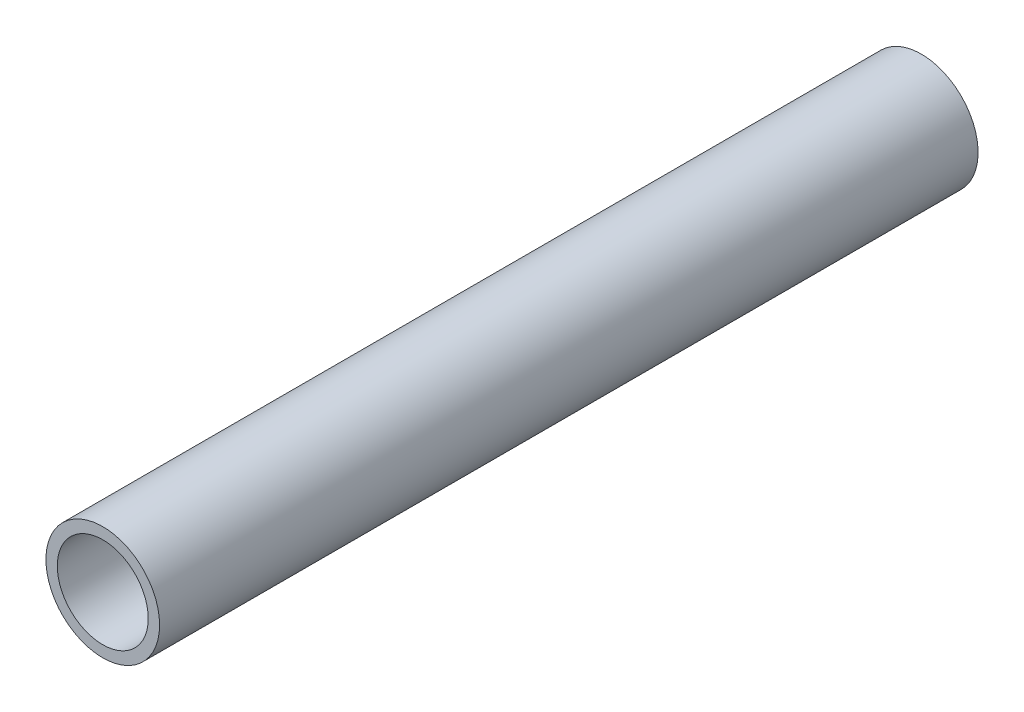
ISO-10303-21;
HEADER;
FILE_DESCRIPTION(('STEP AP214'),'2;1');
FILE_NAME('part.step','',(''),(''),'','','');
FILE_SCHEMA(('AUTOMOTIVE_DESIGN { 1 0 10303 214 1 1 1 1 }'));
ENDSEC;
DATA;
#1=APPLICATION_CONTEXT('core data for automotive mechanical design processes');
#2=APPLICATION_PROTOCOL_DEFINITION('international standard','automotive_design',2000,#1);
#3=PRODUCT_CONTEXT('',#1,'mechanical');
#4=PRODUCT('Part','Part','',(#3));
#5=PRODUCT_RELATED_PRODUCT_CATEGORY('part','',(#4));
#6=PRODUCT_DEFINITION_FORMATION('','',#4);
#7=PRODUCT_DEFINITION_CONTEXT('part definition',#1,'design');
#8=PRODUCT_DEFINITION('design','',#6,#7);
#9=PRODUCT_DEFINITION_SHAPE('','',#8);
#10=(LENGTH_UNIT() NAMED_UNIT(*) SI_UNIT(.MILLI.,.METRE.));
#11=(NAMED_UNIT(*) PLANE_ANGLE_UNIT() SI_UNIT($,.RADIAN.));
#12=(NAMED_UNIT(*) SI_UNIT($,.STERADIAN.) SOLID_ANGLE_UNIT());
#13=UNCERTAINTY_MEASURE_WITH_UNIT(LENGTH_MEASURE(1.E-05),#10,'distance_accuracy_value','');
#14=(GEOMETRIC_REPRESENTATION_CONTEXT(3) GLOBAL_UNCERTAINTY_ASSIGNED_CONTEXT((#13)) GLOBAL_UNIT_ASSIGNED_CONTEXT((#10,
#11,#12)) REPRESENTATION_CONTEXT('',''));
#15=CARTESIAN_POINT('',(0.,0.,0.));
#16=DIRECTION('',(0.,0.,1.));
#17=DIRECTION('',(1.,0.,0.));
#18=AXIS2_PLACEMENT_3D('',#15,#16,#17);
#19=CARTESIAN_POINT('',(0.,0.,0.));
#20=DIRECTION('',(0.,0.,1.));
#21=DIRECTION('',(1.,0.,0.));
#22=AXIS2_PLACEMENT_3D('',#19,#20,#21);
#23=PLANE('',#22);
#24=DIRECTION('',(-1.,0.,0.));
#25=VECTOR('',#24,1.);
#26=CARTESIAN_POINT('',(5.,-11.4564392373896,0.));
#27=LINE('',#26,#25);
#28=CARTESIAN_POINT('',(5.,-11.4564392373896,0.));
#29=VERTEX_POINT('',#28);
#30=CARTESIAN_POINT('',(-5.,-11.4564392373896,0.));
#31=VERTEX_POINT('',#30);
#32=EDGE_CURVE('E242',#29,#31,#27,.T.);
#33=ORIENTED_EDGE('',*,*,#32,.F.);
#34=CARTESIAN_POINT('',(0.,0.,0.));
#35=DIRECTION('',(0.,0.,1.));
#36=DIRECTION('',(1.,0.,0.));
#37=AXIS2_PLACEMENT_3D('',#34,#35,#36);
#38=CIRCLE('',#37,12.5);
#39=EDGE_CURVE('E237',#31,#29,#38,.T.);
#40=ORIENTED_EDGE('',*,*,#39,.F.);
#41=EDGE_LOOP('',(#33,#40));
#42=FACE_BOUND('',#41,.T.);
#43=ADVANCED_FACE('F40',(#42),#23,.F.);
#44=DIRECTION('',(-1.,0.,0.));
#45=VECTOR('',#44,1.);
#46=CARTESIAN_POINT('',(5.,11.4564392373896,0.));
#47=LINE('',#46,#45);
#48=CARTESIAN_POINT('',(-5.,11.4564392373896,0.));
#49=VERTEX_POINT('',#48);
#50=CARTESIAN_POINT('',(5.,11.4564392373896,0.));
#51=VERTEX_POINT('',#50);
#52=EDGE_CURVE('E246',#49,#51,#47,.F.);
#53=ORIENTED_EDGE('',*,*,#52,.F.);
#54=EDGE_CURVE('E229',#51,#49,#38,.T.);
#55=ORIENTED_EDGE('',*,*,#54,.F.);
#56=EDGE_LOOP('',(#53,#55));
#57=FACE_BOUND('',#56,.T.);
#58=ADVANCED_FACE('F187',(#57),#23,.F.);
#59=CARTESIAN_POINT('',(0.,0.,180.));
#60=DIRECTION('',(0.,0.,1.));
#61=DIRECTION('',(1.,0.,0.));
#62=AXIS2_PLACEMENT_3D('',#59,#60,#61);
#63=PLANE('',#62);
#64=CARTESIAN_POINT('',(0.,0.,180.));
#65=DIRECTION('',(0.,0.,1.));
#66=DIRECTION('',(1.,0.,0.));
#67=AXIS2_PLACEMENT_3D('',#64,#65,#66);
#68=CIRCLE('',#67,12.5);
#69=CARTESIAN_POINT('',(12.5,0.,180.));
#70=VERTEX_POINT('',#69);
#71=EDGE_CURVE('E113',#70,#70,#68,.T.);
#72=ORIENTED_EDGE('',*,*,#71,.T.);
#73=EDGE_LOOP('',(#72));
#74=FACE_BOUND('',#73,.T.);
#75=CARTESIAN_POINT('',(0.,0.,180.));
#76=DIRECTION('',(0.,0.,1.));
#77=DIRECTION('',(1.,0.,0.));
#78=AXIS2_PLACEMENT_3D('',#75,#76,#77);
#79=CIRCLE('',#78,10.);
#80=CARTESIAN_POINT('',(10.,0.,180.));
#81=VERTEX_POINT('',#80);
#82=EDGE_CURVE('E217',#81,#81,#79,.T.);
#83=ORIENTED_EDGE('',*,*,#82,.F.);
#84=EDGE_LOOP('',(#83));
#85=FACE_BOUND('',#84,.T.);
#86=ADVANCED_FACE('F194',(#74,#85),#63,.T.);
#87=EDGE_CURVE('E210',#29,#51,#38,.T.);
#88=ORIENTED_EDGE('',*,*,#87,.F.);
#89=DIRECTION('',(0.,1.,0.));
#90=VECTOR('',#89,1.);
#91=CARTESIAN_POINT('',(5.,0.,0.));
#92=LINE('',#91,#90);
#93=CARTESIAN_POINT('',(5.,-10.9087121146357,0.));
#94=VERTEX_POINT('',#93);
#95=EDGE_CURVE('E218',#29,#94,#92,.T.);
#96=ORIENTED_EDGE('',*,*,#95,.T.);
#97=DIRECTION('',(-1.,0.,0.));
#98=VECTOR('',#97,1.);
#99=CARTESIAN_POINT('',(5.,-10.9087121146357,0.));
#100=LINE('',#99,#98);
#101=CARTESIAN_POINT('',(-5.,-10.9087121146357,0.));
#102=VERTEX_POINT('',#101);
#103=EDGE_CURVE('E251',#94,#102,#100,.T.);
#104=ORIENTED_EDGE('',*,*,#103,.T.);
#105=DIRECTION('',(0.,1.,0.));
#106=VECTOR('',#105,1.);
#107=CARTESIAN_POINT('',(-5.,0.,0.));
#108=LINE('',#107,#106);
#109=EDGE_CURVE('E272',#31,#102,#108,.T.);
#110=ORIENTED_EDGE('',*,*,#109,.F.);
#111=EDGE_CURVE('E232',#49,#31,#38,.T.);
#112=ORIENTED_EDGE('',*,*,#111,.F.);
#113=CARTESIAN_POINT('',(-5.,10.9087121146357,0.));
#114=VERTEX_POINT('',#113);
#115=EDGE_CURVE('E270',#114,#49,#108,.T.);
#116=ORIENTED_EDGE('',*,*,#115,.F.);
#117=DIRECTION('',(-1.,0.,0.));
#118=VECTOR('',#117,1.);
#119=CARTESIAN_POINT('',(5.,10.9087121146357,0.));
#120=LINE('',#119,#118);
#121=CARTESIAN_POINT('',(5.,10.9087121146357,0.));
#122=VERTEX_POINT('',#121);
#123=EDGE_CURVE('E120',#114,#122,#120,.F.);
#124=ORIENTED_EDGE('',*,*,#123,.T.);
#125=EDGE_CURVE('E224',#122,#51,#92,.T.);
#126=ORIENTED_EDGE('',*,*,#125,.T.);
#127=EDGE_LOOP('',(#88,#96,#104,#110,#112,#116,#124,#126));
#128=FACE_BOUND('',#127,.T.);
#129=CARTESIAN_POINT('',(0.,0.,0.));
#130=DIRECTION('',(0.,0.,1.));
#131=DIRECTION('',(1.,0.,0.));
#132=AXIS2_PLACEMENT_3D('',#129,#130,#131);
#133=CIRCLE('',#132,10.);
#134=CARTESIAN_POINT('',(10.,0.,0.));
#135=VERTEX_POINT('',#134);
#136=EDGE_CURVE('E214',#135,#135,#133,.T.);
#137=ORIENTED_EDGE('',*,*,#136,.T.);
#138=EDGE_LOOP('',(#137));
#139=FACE_BOUND('',#138,.T.);
#140=ADVANCED_FACE('F189',(#128,#139),#23,.F.);
#141=CARTESIAN_POINT('',(0.,0.,180.));
#142=DIRECTION('',(0.,0.,-1.));
#143=DIRECTION('',(-1.,0.,0.));
#144=AXIS2_PLACEMENT_3D('',#141,#142,#143);
#145=CYLINDRICAL_SURFACE('',#144,12.5);
#146=ORIENTED_EDGE('',*,*,#71,.F.);
#147=EDGE_LOOP('',(#146));
#148=FACE_BOUND('',#147,.T.);
#149=ORIENTED_EDGE('',*,*,#54,.T.);
#150=ORIENTED_EDGE('',*,*,#111,.T.);
#151=ORIENTED_EDGE('',*,*,#39,.T.);
#152=ORIENTED_EDGE('',*,*,#87,.T.);
#153=EDGE_LOOP('',(#149,#150,#151,#152));
#154=FACE_BOUND('',#153,.T.);
#155=ADVANCED_FACE('F42',(#148,#154),#145,.T.);
#156=CARTESIAN_POINT('',(0.,0.,180.));
#157=DIRECTION('',(0.,0.,-1.));
#158=DIRECTION('',(-1.,0.,0.));
#159=AXIS2_PLACEMENT_3D('',#156,#157,#158);
#160=CYLINDRICAL_SURFACE('',#159,10.);
#161=DIRECTION('',(0.,0.,-1.));
#162=VECTOR('',#161,1.);
#163=CARTESIAN_POINT('',(5.,-8.66025403784439,180.));
#164=LINE('',#163,#162);
#165=CARTESIAN_POINT('',(5.,-8.66025403784439,4.01387818865998));
#166=VERTEX_POINT('',#165);
#167=CARTESIAN_POINT('',(5.,-8.66025403784439,3.30662386291808));
#168=VERTEX_POINT('',#167);
#169=EDGE_CURVE('E11',#166,#168,#164,.T.);
#170=ORIENTED_EDGE('',*,*,#169,.F.);
#171=CARTESIAN_POINT('',(5.,-8.66025403784439,4.01387818865998));
#172=CARTESIAN_POINT('',(4.82008154669658,-8.76410176369815,3.91413592086407));
#173=CARTESIAN_POINT('',(4.63627417539551,-8.86277482125367,3.81585166590048));
#174=CARTESIAN_POINT('',(4.26046253513022,-9.04945777136054,3.62410025880277));
#175=CARTESIAN_POINT('',(4.06844552469419,-9.13745021024587,3.53064113108571));
#176=CARTESIAN_POINT('',(3.6735444726537,-9.30330897296587,3.34947749360588));
#177=CARTESIAN_POINT('',(3.47054355256305,-9.38101073590016,3.26187556280599));
#178=CARTESIAN_POINT('',(3.05636570597246,-9.52400065181224,3.09662511759067));
#179=CARTESIAN_POINT('',(2.84519369370648,-9.58929613065176,3.01897073806762));
#180=CARTESIAN_POINT('',(2.4575917232659,-9.69495715150848,2.89070882646822));
#181=CARTESIAN_POINT('',(2.28257576350105,-9.73769870382435,2.83779145738117));
#182=CARTESIAN_POINT('',(1.92789991719414,-9.81407601235486,2.74194234819441));
#183=CARTESIAN_POINT('',(1.74824141347053,-9.84771444652488,2.69900767191055));
#184=CARTESIAN_POINT('',(1.38603690819081,-9.90516637226989,2.62495067166923));
#185=CARTESIAN_POINT('',(1.2035135747387,-9.9290354830804,2.59376156081113));
#186=CARTESIAN_POINT('',(0.835691234393958,-9.96673401065602,2.5442157237096));
#187=CARTESIAN_POINT('',(0.650392381936898,-9.98056398391694,2.52585828617483));
#188=CARTESIAN_POINT('',(0.277023404492982,-9.99792199178797,2.5027843082056));
#189=CARTESIAN_POINT('',(0.0889429239280904,-10.0013703258567,2.49817330267362));
#190=CARTESIAN_POINT('',(-0.286921145275977,-9.99764976573475,2.50313315517893));
#191=CARTESIAN_POINT('',(-0.474704734250775,-9.99048088355496,2.51270399717288));
#192=CARTESIAN_POINT('',(-0.848836131892855,-9.96567705903095,2.54557479353535));
#193=CARTESIAN_POINT('',(-1.03517905304107,-9.94801545212216,2.56890972471664));
#194=CARTESIAN_POINT('',(-1.40458264038539,-9.90261584476655,2.62820964455827));
#195=CARTESIAN_POINT('',(-1.58764287161268,-9.87487651918632,2.66417629416033));
#196=CARTESIAN_POINT('',(-1.99220039244546,-9.80218125114327,2.75702829331244));
#197=CARTESIAN_POINT('',(-2.21257052609303,-9.75470693497974,2.81684746936269));
#198=CARTESIAN_POINT('',(-2.64569626586323,-9.64625293380524,2.95029419175835));
#199=CARTESIAN_POINT('',(-2.85844806127142,-9.58526659670147,3.0239285366944));
#200=CARTESIAN_POINT('',(-3.27602095974106,-9.45070697696876,3.18198736170821));
#201=CARTESIAN_POINT('',(-3.48083355248735,-9.37712062184528,3.26642302488915));
#202=CARTESIAN_POINT('',(-3.88216728590354,-9.21820724995444,3.44326821578856));
#203=CARTESIAN_POINT('',(-4.07869125246982,-9.13288427760634,3.53567499260133));
#204=CARTESIAN_POINT('',(-4.39626872624616,-8.98287114444206,3.69283390198646));
#205=CARTESIAN_POINT('',(-4.51967617717796,-8.92140308246232,3.75595336297528));
#206=CARTESIAN_POINT('',(-4.76259961156357,-8.794108671307,3.88379276030673));
#207=CARTESIAN_POINT('',(-4.88212937403475,-8.7283010532962,3.94850514814532));
#208=CARTESIAN_POINT('',(-5.,-8.66025403784439,4.01387818865998));
#209=B_SPLINE_CURVE_WITH_KNOTS('',3,(#171,#172,#173,#174,#175,#176,#177,#178,#179,#180,#181,
#182,#183,#184,#185,#186,#187,#188,#189,#190,#191,#192,#193,#194,#195,#196,#197,#198,#199,#200,
#201,#202,#203,#204,#205,#206,#207,#208),.UNSPECIFIED.,.F.,.F.,(4,2,2,2,2,2,2,2,2,2,2,2,2,2,2,2,
2,2,4),(0.,0.691341851956641,1.38379866559424,2.08625412807712,2.78829349541358,
3.35112627895848,3.91379330791227,4.47321081224865,5.03259730423154,5.59626743096092,
6.1599369200343,6.72504499459301,7.29022740291808,7.98882324195095,8.68776377342108,
9.38743389753091,10.0868635176568,10.5416445831123,10.9945770557237),.UNSPECIFIED.);
#210=CARTESIAN_POINT('',(-5.,-8.66025403784438,4.01387818865998));
#211=VERTEX_POINT('',#210);
#212=EDGE_CURVE('E49',#166,#211,#209,.T.);
#213=ORIENTED_EDGE('',*,*,#212,.T.);
#214=DIRECTION('',(0.,0.,-1.));
#215=VECTOR('',#214,1.);
#216=CARTESIAN_POINT('',(-5.,-8.66025403784439,180.));
#217=LINE('',#216,#215);
#218=CARTESIAN_POINT('',(-5.,-8.66025403784438,3.30662386291808));
#219=VERTEX_POINT('',#218);
#220=EDGE_CURVE('E167',#211,#219,#217,.T.);
#221=ORIENTED_EDGE('',*,*,#220,.T.);
#222=CARTESIAN_POINT('',(5.,-8.66025403784439,3.30662386291808));
#223=CARTESIAN_POINT('',(4.82516195453835,-8.76116069084542,3.20145819449251));
#224=CARTESIAN_POINT('',(4.64670456953597,-8.85716824931581,3.09749019690897));
#225=CARTESIAN_POINT('',(4.28196806230545,-9.03916673113266,2.89379473618385));
#226=CARTESIAN_POINT('',(4.09567653506667,-9.12514088708735,2.79407454346849));
#227=CARTESIAN_POINT('',(3.71197846270353,-9.2879124620808,2.59941343214977));
#228=CARTESIAN_POINT('',(3.51443553045837,-9.36452577564421,2.50458478071013));
#229=CARTESIAN_POINT('',(3.11122082111521,-9.50610425689326,2.32441795655835));
#230=CARTESIAN_POINT('',(2.90555407478051,-9.57107649959323,2.23907403143837));
#231=CARTESIAN_POINT('',(2.37075207397384,-9.72075056001073,2.03777130738265));
#232=CARTESIAN_POINT('',(2.03558507074426,-9.79682027068555,1.93058217472068));
#233=CARTESIAN_POINT('',(1.52137039526288,-9.88511623587745,1.80346482514438));
#234=CARTESIAN_POINT('',(1.34855608837975,-9.91021214838895,1.76675976869335));
#235=CARTESIAN_POINT('',(0.999704620471346,-9.95145121853615,1.70596558110729));
#236=CARTESIAN_POINT('',(0.823669314534935,-9.96759937164545,1.68186941093524));
#237=CARTESIAN_POINT('',(0.467635326863651,-9.99067050076046,1.64732651345712));
#238=CARTESIAN_POINT('',(0.287614336625637,-9.99748748906368,1.63703662991511));
#239=CARTESIAN_POINT('',(-0.0727722623708487,-10.00135854973,1.63120203279879));
#240=CARTESIAN_POINT('',(-0.25313786225175,-9.99841287029075,1.63565694436544));
#241=CARTESIAN_POINT('',(-0.612874353371986,-9.98282890827138,1.65907798957394));
#242=CARTESIAN_POINT('',(-0.792242295542309,-9.9701699277578,1.67807511079687));
#243=CARTESIAN_POINT('',(-1.14809702262397,-9.93548462910008,1.72956885388206));
#244=CARTESIAN_POINT('',(-1.32458337019917,-9.91345690254543,1.7620675054223));
#245=CARTESIAN_POINT('',(-1.70632159221413,-9.85557726879622,1.84621536728624));
#246=CARTESIAN_POINT('',(-1.91075453125979,-9.81790657135514,1.90031423909942));
#247=CARTESIAN_POINT('',(-2.31295681180811,-9.73101315682729,2.02231975942194));
#248=CARTESIAN_POINT('',(-2.510722654669,-9.68178447922531,2.09023352992985));
#249=CARTESIAN_POINT('',(-2.89963018636721,-9.57251588397588,2.23708015886137));
#250=CARTESIAN_POINT('',(-3.09075277069543,-9.51244744005009,2.31604196542785));
#251=CARTESIAN_POINT('',(-3.46577487631523,-9.3823122890741,2.48220302473786));
#252=CARTESIAN_POINT('',(-3.64967594573692,-9.31224774005098,2.56940049813993));
#253=CARTESIAN_POINT('',(-4.03453037500343,-9.15268290085554,2.76182798685033));
#254=CARTESIAN_POINT('',(-4.23449404591819,-9.06183691476436,2.86791314491051));
#255=CARTESIAN_POINT('',(-4.62429787880894,-8.8691923764082,3.08445929666655));
#256=CARTESIAN_POINT('',(-4.81420314802685,-8.76748182146515,3.19488114407874));
#257=CARTESIAN_POINT('',(-5.,-8.66025403784439,3.30662386291808));
#258=B_SPLINE_CURVE_WITH_KNOTS('',3,(#222,#223,#224,#225,#226,#227,#228,#229,#230,#231,#232,
#233,#234,#235,#236,#237,#238,#239,#240,#241,#242,#243,#244,#245,#246,#247,#248,#249,#250,#251,
#252,#253,#254,#255,#256,#257),.UNSPECIFIED.,.F.,.F.,(4,2,2,2,2,2,2,2,2,2,2,2,2,2,2,2,2,4),(0.,
0.68284922287536,1.36682373036995,2.06260941823754,2.75797078804696,3.83347678621023,
4.36823430697502,4.90269297464557,5.44317325993769,5.98363980462796,6.52526123100377,
7.06696410852384,7.71035015169294,8.35406872429875,8.99950670982006,9.64480556406339,
10.376022596591,11.1017114061016),.UNSPECIFIED.);
#259=EDGE_CURVE('E159',#168,#219,#258,.T.);
#260=ORIENTED_EDGE('',*,*,#259,.F.);
#261=EDGE_LOOP('',(#170,#213,#221,#260));
#262=FACE_BOUND('',#261,.T.);
#263=DIRECTION('',(0.,0.,-1.));
#264=VECTOR('',#263,1.);
#265=CARTESIAN_POINT('',(5.,8.66025403784439,180.));
#266=LINE('',#265,#264);
#267=CARTESIAN_POINT('',(5.,8.66025403784439,3.30662386291808));
#268=VERTEX_POINT('',#267);
#269=CARTESIAN_POINT('',(5.,8.66025403784439,4.01387818865998));
#270=VERTEX_POINT('',#269);
#271=EDGE_CURVE('E128',#268,#270,#266,.F.);
#272=ORIENTED_EDGE('',*,*,#271,.F.);
#273=CARTESIAN_POINT('',(-5.,8.66025403784439,3.30662386291808));
#274=CARTESIAN_POINT('',(-4.82516195453835,8.76116069084542,3.20145819449251));
#275=CARTESIAN_POINT('',(-4.64670456953597,8.85716824931581,3.09749019690897));
#276=CARTESIAN_POINT('',(-4.28196806230545,9.03916673113266,2.89379473618385));
#277=CARTESIAN_POINT('',(-4.09567653506667,9.12514088708735,2.79407454346849));
#278=CARTESIAN_POINT('',(-3.71197846270353,9.2879124620808,2.59941343214977));
#279=CARTESIAN_POINT('',(-3.51443553045837,9.36452577564421,2.50458478071013));
#280=CARTESIAN_POINT('',(-3.11122082111521,9.50610425689326,2.32441795655835));
#281=CARTESIAN_POINT('',(-2.90555407478051,9.57107649959323,2.23907403143837));
#282=CARTESIAN_POINT('',(-2.37075207397384,9.72075056001073,2.03777130738265));
#283=CARTESIAN_POINT('',(-2.03558507074426,9.79682027068555,1.93058217472068));
#284=CARTESIAN_POINT('',(-1.52137039526288,9.88511623587745,1.80346482514438));
#285=CARTESIAN_POINT('',(-1.34855608837975,9.91021214838895,1.76675976869335));
#286=CARTESIAN_POINT('',(-0.999704620471346,9.95145121853615,1.70596558110729));
#287=CARTESIAN_POINT('',(-0.823669314534935,9.96759937164545,1.68186941093524));
#288=CARTESIAN_POINT('',(-0.467635326863651,9.99067050076046,1.64732651345712));
#289=CARTESIAN_POINT('',(-0.287614336625637,9.99748748906368,1.63703662991511));
#290=CARTESIAN_POINT('',(0.0727722623708487,10.00135854973,1.63120203279879));
#291=CARTESIAN_POINT('',(0.25313786225175,9.99841287029075,1.63565694436544));
#292=CARTESIAN_POINT('',(0.612874353371986,9.98282890827138,1.65907798957394));
#293=CARTESIAN_POINT('',(0.792242295542309,9.9701699277578,1.67807511079687));
#294=CARTESIAN_POINT('',(1.14809702262397,9.93548462910008,1.72956885388206));
#295=CARTESIAN_POINT('',(1.32458337019917,9.91345690254543,1.7620675054223));
#296=CARTESIAN_POINT('',(1.70632159221413,9.85557726879622,1.84621536728624));
#297=CARTESIAN_POINT('',(1.91075453125979,9.81790657135514,1.90031423909942));
#298=CARTESIAN_POINT('',(2.31295681180811,9.73101315682729,2.02231975942194));
#299=CARTESIAN_POINT('',(2.510722654669,9.68178447922531,2.09023352992985));
#300=CARTESIAN_POINT('',(2.89963018636721,9.57251588397588,2.23708015886137));
#301=CARTESIAN_POINT('',(3.09075277069543,9.51244744005009,2.31604196542785));
#302=CARTESIAN_POINT('',(3.46577487631523,9.3823122890741,2.48220302473786));
#303=CARTESIAN_POINT('',(3.64967594573692,9.31224774005098,2.56940049813993));
#304=CARTESIAN_POINT('',(4.03453037500343,9.15268290085554,2.76182798685033));
#305=CARTESIAN_POINT('',(4.23449404591819,9.06183691476436,2.86791314491051));
#306=CARTESIAN_POINT('',(4.62429787880894,8.8691923764082,3.08445929666655));
#307=CARTESIAN_POINT('',(4.81420314802685,8.76748182146515,3.19488114407874));
#308=CARTESIAN_POINT('',(5.,8.66025403784439,3.30662386291808));
#309=B_SPLINE_CURVE_WITH_KNOTS('',3,(#273,#274,#275,#276,#277,#278,#279,#280,#281,#282,#283,
#284,#285,#286,#287,#288,#289,#290,#291,#292,#293,#294,#295,#296,#297,#298,#299,#300,#301,#302,
#303,#304,#305,#306,#307,#308),.UNSPECIFIED.,.F.,.F.,(4,2,2,2,2,2,2,2,2,2,2,2,2,2,2,2,2,4),(0.,
0.68284922287536,1.36682373036995,2.06260941823754,2.75797078804696,3.83347678621023,
4.36823430697502,4.90269297464557,5.44317325993769,5.98363980462796,6.52526123100377,
7.06696410852384,7.71035015169294,8.35406872429875,8.99950670982006,9.64480556406339,
10.376022596591,11.1017114061016),.UNSPECIFIED.);
#310=CARTESIAN_POINT('',(-5.,8.66025403784438,3.30662386291808));
#311=VERTEX_POINT('',#310);
#312=EDGE_CURVE('E112',#311,#268,#309,.T.);
#313=ORIENTED_EDGE('',*,*,#312,.F.);
#314=DIRECTION('',(0.,0.,-1.));
#315=VECTOR('',#314,1.);
#316=CARTESIAN_POINT('',(-5.,8.66025403784439,180.));
#317=LINE('',#316,#315);
#318=CARTESIAN_POINT('',(-5.,8.66025403784438,4.01387818865998));
#319=VERTEX_POINT('',#318);
#320=EDGE_CURVE('E103',#311,#319,#317,.F.);
#321=ORIENTED_EDGE('',*,*,#320,.T.);
#322=CARTESIAN_POINT('',(-5.,8.66025403784439,4.01387818865998));
#323=CARTESIAN_POINT('',(-4.82008154669658,8.76410176369815,3.91413592086407));
#324=CARTESIAN_POINT('',(-4.63627417539551,8.86277482125367,3.81585166590048));
#325=CARTESIAN_POINT('',(-4.26046253513022,9.04945777136054,3.62410025880277));
#326=CARTESIAN_POINT('',(-4.06844552469419,9.13745021024587,3.53064113108571));
#327=CARTESIAN_POINT('',(-3.6735444726537,9.30330897296587,3.34947749360588));
#328=CARTESIAN_POINT('',(-3.47054355256305,9.38101073590016,3.26187556280599));
#329=CARTESIAN_POINT('',(-3.05636570597246,9.52400065181224,3.09662511759067));
#330=CARTESIAN_POINT('',(-2.84519369370648,9.58929613065176,3.01897073806762));
#331=CARTESIAN_POINT('',(-2.4575917232659,9.69495715150848,2.89070882646822));
#332=CARTESIAN_POINT('',(-2.28257576350105,9.73769870382435,2.83779145738117));
#333=CARTESIAN_POINT('',(-1.92789991719414,9.81407601235486,2.74194234819441));
#334=CARTESIAN_POINT('',(-1.74824141347053,9.84771444652488,2.69900767191055));
#335=CARTESIAN_POINT('',(-1.38603690819081,9.90516637226989,2.62495067166923));
#336=CARTESIAN_POINT('',(-1.2035135747387,9.9290354830804,2.59376156081113));
#337=CARTESIAN_POINT('',(-0.835691234393958,9.96673401065602,2.5442157237096));
#338=CARTESIAN_POINT('',(-0.650392381936898,9.98056398391694,2.52585828617483));
#339=CARTESIAN_POINT('',(-0.277023404492982,9.99792199178797,2.5027843082056));
#340=CARTESIAN_POINT('',(-0.0889429239280904,10.0013703258567,2.49817330267362));
#341=CARTESIAN_POINT('',(0.286921145275977,9.99764976573475,2.50313315517893));
#342=CARTESIAN_POINT('',(0.474704734250775,9.99048088355496,2.51270399717288));
#343=CARTESIAN_POINT('',(0.848836131892855,9.96567705903095,2.54557479353535));
#344=CARTESIAN_POINT('',(1.03517905304107,9.94801545212216,2.56890972471664));
#345=CARTESIAN_POINT('',(1.40458264038539,9.90261584476655,2.62820964455827));
#346=CARTESIAN_POINT('',(1.58764287161268,9.87487651918632,2.66417629416033));
#347=CARTESIAN_POINT('',(1.99220039244546,9.80218125114327,2.75702829331244));
#348=CARTESIAN_POINT('',(2.21257052609303,9.75470693497974,2.81684746936269));
#349=CARTESIAN_POINT('',(2.64569626586323,9.64625293380524,2.95029419175835));
#350=CARTESIAN_POINT('',(2.85844806127142,9.58526659670147,3.0239285366944));
#351=CARTESIAN_POINT('',(3.27602095974106,9.45070697696876,3.18198736170821));
#352=CARTESIAN_POINT('',(3.48083355248735,9.37712062184528,3.26642302488915));
#353=CARTESIAN_POINT('',(3.88216728590354,9.21820724995444,3.44326821578856));
#354=CARTESIAN_POINT('',(4.07869125246982,9.13288427760634,3.53567499260133));
#355=CARTESIAN_POINT('',(4.39626872624616,8.98287114444206,3.69283390198646));
#356=CARTESIAN_POINT('',(4.51967617717796,8.92140308246232,3.75595336297528));
#357=CARTESIAN_POINT('',(4.76259961156357,8.794108671307,3.88379276030673));
#358=CARTESIAN_POINT('',(4.88212937403475,8.7283010532962,3.94850514814532));
#359=CARTESIAN_POINT('',(5.,8.66025403784439,4.01387818865998));
#360=B_SPLINE_CURVE_WITH_KNOTS('',3,(#322,#323,#324,#325,#326,#327,#328,#329,#330,#331,#332,
#333,#334,#335,#336,#337,#338,#339,#340,#341,#342,#343,#344,#345,#346,#347,#348,#349,#350,#351,
#352,#353,#354,#355,#356,#357,#358,#359),.UNSPECIFIED.,.F.,.F.,(4,2,2,2,2,2,2,2,2,2,2,2,2,2,2,2,
2,2,4),(0.,0.691341851956641,1.38379866559424,2.08625412807712,2.78829349541358,
3.35112627895848,3.91379330791227,4.47321081224865,5.03259730423154,5.59626743096092,
6.1599369200343,6.72504499459301,7.29022740291808,7.98882324195095,8.68776377342108,
9.38743389753091,10.0868635176568,10.5416445831123,10.9945770557237),.UNSPECIFIED.);
#361=EDGE_CURVE('E130',#319,#270,#360,.T.);
#362=ORIENTED_EDGE('',*,*,#361,.T.);
#363=EDGE_LOOP('',(#272,#313,#321,#362));
#364=FACE_BOUND('',#363,.T.);
#365=ORIENTED_EDGE('',*,*,#82,.T.);
#366=EDGE_LOOP('',(#365));
#367=FACE_BOUND('',#366,.T.);
#368=ORIENTED_EDGE('',*,*,#136,.F.);
#369=EDGE_LOOP('',(#368));
#370=FACE_BOUND('',#369,.T.);
#371=ADVANCED_FACE('F126',(#262,#364,#367,#370),#160,.F.);
#372=CARTESIAN_POINT('',(-5.,0.,-5.));
#373=DIRECTION('',(1.,0.,0.));
#374=DIRECTION('',(0.,0.,-1.));
#375=AXIS2_PLACEMENT_3D('',#372,#373,#374);
#376=PLANE('',#375);
#377=ORIENTED_EDGE('',*,*,#115,.T.);
#378=CARTESIAN_POINT('',(-5.,0.,-5.));
#379=DIRECTION('',(1.,0.,0.));
#380=DIRECTION('',(0.,0.,-1.));
#381=AXIS2_PLACEMENT_3D('',#378,#379,#380);
#382=CIRCLE('',#381,12.5);
#383=EDGE_CURVE('E106',#49,#319,#382,.T.);
#384=ORIENTED_EDGE('',*,*,#383,.T.);
#385=ORIENTED_EDGE('',*,*,#320,.F.);
#386=CARTESIAN_POINT('',(-5.,0.,-5.));
#387=DIRECTION('',(1.,0.,0.));
#388=DIRECTION('',(0.,0.,-1.));
#389=AXIS2_PLACEMENT_3D('',#386,#387,#388);
#390=CIRCLE('',#389,12.);
#391=EDGE_CURVE('E56',#114,#311,#390,.T.);
#392=ORIENTED_EDGE('',*,*,#391,.F.);
#393=EDGE_LOOP('',(#377,#384,#385,#392));
#394=FACE_BOUND('',#393,.T.);
#395=ADVANCED_FACE('F104',(#394),#376,.T.);
#396=CARTESIAN_POINT('',(5.,0.,-5.));
#397=DIRECTION('',(-1.,0.,0.));
#398=DIRECTION('',(0.,0.,1.));
#399=AXIS2_PLACEMENT_3D('',#396,#397,#398);
#400=CYLINDRICAL_SURFACE('',#399,12.);
#401=ORIENTED_EDGE('',*,*,#391,.T.);
#402=ORIENTED_EDGE('',*,*,#312,.T.);
#403=CARTESIAN_POINT('',(5.,0.,-5.));
#404=DIRECTION('',(1.,0.,0.));
#405=DIRECTION('',(0.,0.,-1.));
#406=AXIS2_PLACEMENT_3D('',#403,#404,#405);
#407=CIRCLE('',#406,12.);
#408=EDGE_CURVE('E256',#122,#268,#407,.T.);
#409=ORIENTED_EDGE('',*,*,#408,.F.);
#410=ORIENTED_EDGE('',*,*,#123,.F.);
#411=EDGE_LOOP('',(#401,#402,#409,#410));
#412=FACE_BOUND('',#411,.T.);
#413=ADVANCED_FACE('F116',(#412),#400,.T.);
#414=CARTESIAN_POINT('',(5.,0.,-5.));
#415=DIRECTION('',(-1.,0.,0.));
#416=DIRECTION('',(0.,0.,1.));
#417=AXIS2_PLACEMENT_3D('',#414,#415,#416);
#418=CYLINDRICAL_SURFACE('',#417,12.5);
#419=ORIENTED_EDGE('',*,*,#52,.T.);
#420=CARTESIAN_POINT('',(5.,0.,-5.));
#421=DIRECTION('',(1.,0.,0.));
#422=DIRECTION('',(0.,0.,-1.));
#423=AXIS2_PLACEMENT_3D('',#420,#421,#422);
#424=CIRCLE('',#423,12.5);
#425=EDGE_CURVE('E258',#51,#270,#424,.T.);
#426=ORIENTED_EDGE('',*,*,#425,.T.);
#427=ORIENTED_EDGE('',*,*,#361,.F.);
#428=ORIENTED_EDGE('',*,*,#383,.F.);
#429=EDGE_LOOP('',(#419,#426,#427,#428));
#430=FACE_BOUND('',#429,.T.);
#431=ADVANCED_FACE('F153',(#430),#418,.F.);
#432=CARTESIAN_POINT('',(5.,0.,-5.));
#433=DIRECTION('',(1.,0.,0.));
#434=DIRECTION('',(0.,0.,-1.));
#435=AXIS2_PLACEMENT_3D('',#432,#433,#434);
#436=PLANE('',#435);
#437=ORIENTED_EDGE('',*,*,#408,.T.);
#438=ORIENTED_EDGE('',*,*,#271,.T.);
#439=ORIENTED_EDGE('',*,*,#425,.F.);
#440=ORIENTED_EDGE('',*,*,#125,.F.);
#441=EDGE_LOOP('',(#437,#438,#439,#440));
#442=FACE_BOUND('',#441,.T.);
#443=ADVANCED_FACE('F176',(#442),#436,.F.);
#444=EDGE_CURVE('E260',#166,#29,#424,.T.);
#445=ORIENTED_EDGE('',*,*,#444,.F.);
#446=ORIENTED_EDGE('',*,*,#169,.T.);
#447=EDGE_CURVE('E261',#168,#94,#407,.T.);
#448=ORIENTED_EDGE('',*,*,#447,.T.);
#449=ORIENTED_EDGE('',*,*,#95,.F.);
#450=EDGE_LOOP('',(#445,#446,#448,#449));
#451=FACE_BOUND('',#450,.T.);
#452=ADVANCED_FACE('F156',(#451),#436,.F.);
#453=ORIENTED_EDGE('',*,*,#32,.T.);
#454=EDGE_CURVE('E64',#211,#31,#382,.T.);
#455=ORIENTED_EDGE('',*,*,#454,.F.);
#456=ORIENTED_EDGE('',*,*,#212,.F.);
#457=ORIENTED_EDGE('',*,*,#444,.T.);
#458=EDGE_LOOP('',(#453,#455,#456,#457));
#459=FACE_BOUND('',#458,.T.);
#460=ADVANCED_FACE('F178',(#459),#418,.F.);
#461=ORIENTED_EDGE('',*,*,#447,.F.);
#462=ORIENTED_EDGE('',*,*,#259,.T.);
#463=EDGE_CURVE('E123',#219,#102,#390,.T.);
#464=ORIENTED_EDGE('',*,*,#463,.T.);
#465=ORIENTED_EDGE('',*,*,#103,.F.);
#466=EDGE_LOOP('',(#461,#462,#464,#465));
#467=FACE_BOUND('',#466,.T.);
#468=ADVANCED_FACE('F154',(#467),#400,.T.);
#469=ORIENTED_EDGE('',*,*,#109,.T.);
#470=ORIENTED_EDGE('',*,*,#463,.F.);
#471=ORIENTED_EDGE('',*,*,#220,.F.);
#472=ORIENTED_EDGE('',*,*,#454,.T.);
#473=EDGE_LOOP('',(#469,#470,#471,#472));
#474=FACE_BOUND('',#473,.T.);
#475=ADVANCED_FACE('F155',(#474),#376,.T.);
#476=CLOSED_SHELL('',(#43,#58,#86,#140,#155,#371,#395,#413,#431,#443,#452,#460,#468,#475));
#477=MANIFOLD_SOLID_BREP('B2',#476);
#478=ADVANCED_BREP_SHAPE_REPRESENTATION('',(#18,#477),#14);
#479=SHAPE_DEFINITION_REPRESENTATION(#9,#478);
ENDSEC;
END-ISO-10303-21;
